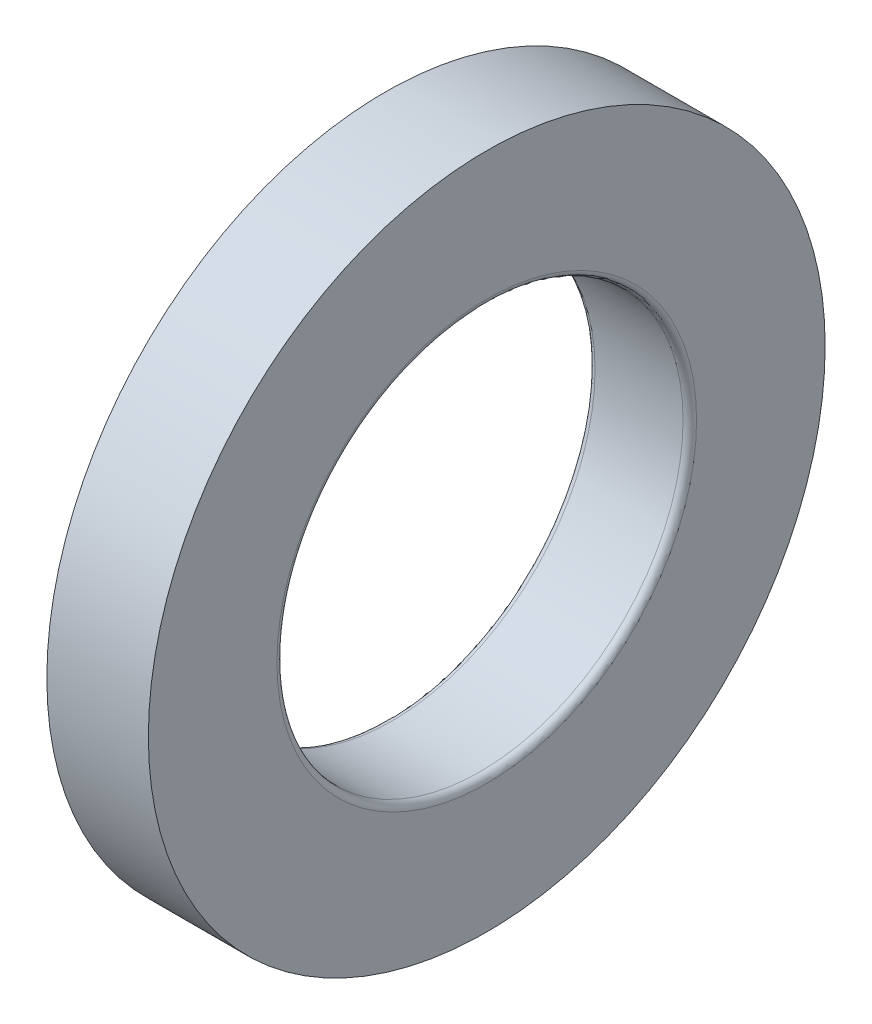
ISO-10303-21;
HEADER;
FILE_DESCRIPTION(('STEP AP214'),'2;1');
FILE_NAME('part.step','',(''),(''),'','','');
FILE_SCHEMA(('AUTOMOTIVE_DESIGN { 1 0 10303 214 1 1 1 1 }'));
ENDSEC;
DATA;
#1=APPLICATION_CONTEXT('core data for automotive mechanical design processes');
#2=APPLICATION_PROTOCOL_DEFINITION('international standard','automotive_design',2000,#1);
#3=PRODUCT_CONTEXT('',#1,'mechanical');
#4=PRODUCT('Part','Part','',(#3));
#5=PRODUCT_RELATED_PRODUCT_CATEGORY('part','',(#4));
#6=PRODUCT_DEFINITION_FORMATION('','',#4);
#7=PRODUCT_DEFINITION_CONTEXT('part definition',#1,'design');
#8=PRODUCT_DEFINITION('design','',#6,#7);
#9=PRODUCT_DEFINITION_SHAPE('','',#8);
#10=(LENGTH_UNIT() NAMED_UNIT(*) SI_UNIT(.MILLI.,.METRE.));
#11=(NAMED_UNIT(*) PLANE_ANGLE_UNIT() SI_UNIT($,.RADIAN.));
#12=(NAMED_UNIT(*) SI_UNIT($,.STERADIAN.) SOLID_ANGLE_UNIT());
#13=UNCERTAINTY_MEASURE_WITH_UNIT(LENGTH_MEASURE(1.E-05),#10,'distance_accuracy_value','');
#14=(GEOMETRIC_REPRESENTATION_CONTEXT(3) GLOBAL_UNCERTAINTY_ASSIGNED_CONTEXT((#13)) GLOBAL_UNIT_ASSIGNED_CONTEXT((#10,
#11,#12)) REPRESENTATION_CONTEXT('',''));
#15=CARTESIAN_POINT('',(0.,0.,0.));
#16=DIRECTION('',(0.,0.,1.));
#17=DIRECTION('',(1.,0.,0.));
#18=AXIS2_PLACEMENT_3D('',#15,#16,#17);
#19=CARTESIAN_POINT('',(15.,0.,0.));
#20=DIRECTION('',(-1.,0.,0.));
#21=DIRECTION('',(0.,0.,1.));
#22=AXIS2_PLACEMENT_3D('',#19,#20,#21);
#23=CYLINDRICAL_SURFACE('',#22,50.);
#24=CARTESIAN_POINT('',(15.,0.,0.));
#25=DIRECTION('',(1.,0.,0.));
#26=DIRECTION('',(0.,0.,-1.));
#27=AXIS2_PLACEMENT_3D('',#24,#25,#26);
#28=CIRCLE('',#27,50.);
#29=CARTESIAN_POINT('',(15.,0.,-50.));
#30=VERTEX_POINT('',#29);
#31=EDGE_CURVE('E64',#30,#30,#28,.T.);
#32=ORIENTED_EDGE('',*,*,#31,.F.);
#33=EDGE_LOOP('',(#32));
#34=FACE_BOUND('',#33,.T.);
#35=CARTESIAN_POINT('',(0.,0.,0.));
#36=DIRECTION('',(1.,0.,0.));
#37=DIRECTION('',(0.,0.,-1.));
#38=AXIS2_PLACEMENT_3D('',#35,#36,#37);
#39=CIRCLE('',#38,50.);
#40=CARTESIAN_POINT('',(0.,0.,-50.));
#41=VERTEX_POINT('',#40);
#42=EDGE_CURVE('E65',#41,#41,#39,.T.);
#43=ORIENTED_EDGE('',*,*,#42,.T.);
#44=EDGE_LOOP('',(#43));
#45=FACE_BOUND('',#44,.T.);
#46=ADVANCED_FACE('F40',(#34,#45),#23,.T.);
#47=CARTESIAN_POINT('',(15.,0.,0.));
#48=DIRECTION('',(1.,0.,0.));
#49=DIRECTION('',(0.,0.,-1.));
#50=AXIS2_PLACEMENT_3D('',#47,#48,#49);
#51=PLANE('',#50);
#52=CARTESIAN_POINT('',(15.,0.,0.));
#53=DIRECTION('',(1.,0.,0.));
#54=DIRECTION('',(0.,0.,-1.));
#55=AXIS2_PLACEMENT_3D('',#52,#53,#54);
#56=CIRCLE('',#55,31.);
#57=CARTESIAN_POINT('',(15.,0.,-31.));
#58=VERTEX_POINT('',#57);
#59=EDGE_CURVE('E48',#58,#58,#56,.F.);
#60=ORIENTED_EDGE('',*,*,#59,.T.);
#61=EDGE_LOOP('',(#60));
#62=FACE_BOUND('',#61,.T.);
#63=ORIENTED_EDGE('',*,*,#31,.T.);
#64=EDGE_LOOP('',(#63));
#65=FACE_BOUND('',#64,.T.);
#66=ADVANCED_FACE('F73',(#62,#65),#51,.T.);
#67=CARTESIAN_POINT('',(0.,0.,0.));
#68=DIRECTION('',(1.,0.,0.));
#69=DIRECTION('',(0.,0.,-1.));
#70=AXIS2_PLACEMENT_3D('',#67,#68,#69);
#71=PLANE('',#70);
#72=CARTESIAN_POINT('',(0.,0.,0.));
#73=DIRECTION('',(1.,0.,0.));
#74=DIRECTION('',(0.,0.,-1.));
#75=AXIS2_PLACEMENT_3D('',#72,#73,#74);
#76=CIRCLE('',#75,31.);
#77=CARTESIAN_POINT('',(0.,0.,-31.));
#78=VERTEX_POINT('',#77);
#79=EDGE_CURVE('E10',#78,#78,#76,.T.);
#80=ORIENTED_EDGE('',*,*,#79,.T.);
#81=EDGE_LOOP('',(#80));
#82=FACE_BOUND('',#81,.T.);
#83=ORIENTED_EDGE('',*,*,#42,.F.);
#84=EDGE_LOOP('',(#83));
#85=FACE_BOUND('',#84,.T.);
#86=ADVANCED_FACE('F80',(#82,#85),#71,.F.);
#87=CARTESIAN_POINT('',(0.,0.,0.));
#88=DIRECTION('',(1.,0.,0.));
#89=DIRECTION('',(0.,0.,-1.));
#90=AXIS2_PLACEMENT_3D('',#87,#88,#89);
#91=CYLINDRICAL_SURFACE('',#90,30.);
#92=CARTESIAN_POINT('',(14.,0.,0.));
#93=DIRECTION('',(1.,0.,0.));
#94=DIRECTION('',(0.,0.,-1.));
#95=AXIS2_PLACEMENT_3D('',#92,#93,#94);
#96=CIRCLE('',#95,30.);
#97=CARTESIAN_POINT('',(14.,0.,-30.));
#98=VERTEX_POINT('',#97);
#99=EDGE_CURVE('E53',#98,#98,#96,.T.);
#100=ORIENTED_EDGE('',*,*,#99,.T.);
#101=EDGE_LOOP('',(#100));
#102=FACE_BOUND('',#101,.T.);
#103=CARTESIAN_POINT('',(1.,0.,0.));
#104=DIRECTION('',(1.,0.,0.));
#105=DIRECTION('',(0.,0.,-1.));
#106=AXIS2_PLACEMENT_3D('',#103,#104,#105);
#107=CIRCLE('',#106,30.);
#108=CARTESIAN_POINT('',(1.,0.,-30.));
#109=VERTEX_POINT('',#108);
#110=EDGE_CURVE('E58',#109,#109,#107,.F.);
#111=ORIENTED_EDGE('',*,*,#110,.T.);
#112=EDGE_LOOP('',(#111));
#113=FACE_BOUND('',#112,.T.);
#114=ADVANCED_FACE('F82',(#102,#113),#91,.F.);
#115=CARTESIAN_POINT('',(14.,0.,0.));
#116=DIRECTION('',(1.,0.,0.));
#117=DIRECTION('',(0.,0.,-1.));
#118=AXIS2_PLACEMENT_3D('',#115,#116,#117);
#119=TOROIDAL_SURFACE('',#118,31.,1.);
#120=ORIENTED_EDGE('',*,*,#59,.F.);
#121=EDGE_LOOP('',(#120));
#122=FACE_BOUND('',#121,.T.);
#123=ORIENTED_EDGE('',*,*,#99,.F.);
#124=EDGE_LOOP('',(#123));
#125=FACE_BOUND('',#124,.T.);
#126=ADVANCED_FACE('F88',(#122,#125),#119,.T.);
#127=CARTESIAN_POINT('',(1.,0.,0.));
#128=DIRECTION('',(1.,0.,0.));
#129=DIRECTION('',(0.,0.,-1.));
#130=AXIS2_PLACEMENT_3D('',#127,#128,#129);
#131=TOROIDAL_SURFACE('',#130,31.,1.);
#132=ORIENTED_EDGE('',*,*,#110,.F.);
#133=EDGE_LOOP('',(#132));
#134=FACE_BOUND('',#133,.T.);
#135=ORIENTED_EDGE('',*,*,#79,.F.);
#136=EDGE_LOOP('',(#135));
#137=FACE_BOUND('',#136,.T.);
#138=ADVANCED_FACE('F42',(#134,#137),#131,.T.);
#139=CLOSED_SHELL('',(#46,#66,#86,#114,#126,#138));
#140=MANIFOLD_SOLID_BREP('B2',#139);
#141=ADVANCED_BREP_SHAPE_REPRESENTATION('',(#18,#140),#14);
#142=SHAPE_DEFINITION_REPRESENTATION(#9,#141);
ENDSEC;
END-ISO-10303-21;
